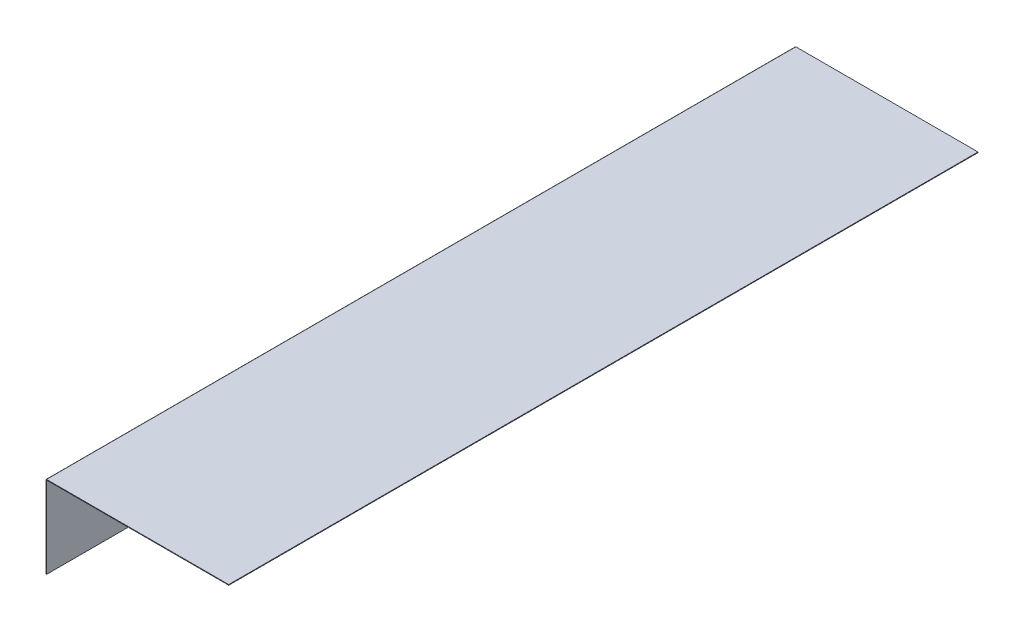
ISO-10303-21;
HEADER;
FILE_DESCRIPTION(('STEP AP214'),'2;1');
FILE_NAME('part.step','',(''),(''),'','','');
FILE_SCHEMA(('AUTOMOTIVE_DESIGN { 1 0 10303 214 1 1 1 1 }'));
ENDSEC;
DATA;
#1=APPLICATION_CONTEXT('core data for automotive mechanical design processes');
#2=APPLICATION_PROTOCOL_DEFINITION('international standard','automotive_design',2000,#1);
#3=PRODUCT_CONTEXT('',#1,'mechanical');
#4=PRODUCT('Part','Part','',(#3));
#5=PRODUCT_RELATED_PRODUCT_CATEGORY('part','',(#4));
#6=PRODUCT_DEFINITION_FORMATION('','',#4);
#7=PRODUCT_DEFINITION_CONTEXT('part definition',#1,'design');
#8=PRODUCT_DEFINITION('design','',#6,#7);
#9=PRODUCT_DEFINITION_SHAPE('','',#8);
#10=(LENGTH_UNIT() NAMED_UNIT(*) SI_UNIT(.MILLI.,.METRE.));
#11=(NAMED_UNIT(*) PLANE_ANGLE_UNIT() SI_UNIT($,.RADIAN.));
#12=(NAMED_UNIT(*) SI_UNIT($,.STERADIAN.) SOLID_ANGLE_UNIT());
#13=UNCERTAINTY_MEASURE_WITH_UNIT(LENGTH_MEASURE(1.E-05),#10,'distance_accuracy_value','');
#14=(GEOMETRIC_REPRESENTATION_CONTEXT(3) GLOBAL_UNCERTAINTY_ASSIGNED_CONTEXT((#13)) GLOBAL_UNIT_ASSIGNED_CONTEXT((#10,
#11,#12)) REPRESENTATION_CONTEXT('',''));
#15=CARTESIAN_POINT('',(0.,0.,0.));
#16=DIRECTION('',(0.,0.,1.));
#17=DIRECTION('',(1.,0.,0.));
#18=AXIS2_PLACEMENT_3D('',#15,#16,#17);
#19=CARTESIAN_POINT('',(1.,0.,1230.));
#20=DIRECTION('',(0.,1.,0.));
#21=DIRECTION('',(-1.,0.,0.));
#22=AXIS2_PLACEMENT_3D('',#19,#20,#21);
#23=PLANE('',#22);
#24=DIRECTION('',(1.,0.,0.));
#25=VECTOR('',#24,1.);
#26=CARTESIAN_POINT('',(1.,0.,0.));
#27=LINE('',#26,#25);
#28=CARTESIAN_POINT('',(0.,0.,0.));
#29=VERTEX_POINT('',#28);
#30=CARTESIAN_POINT('',(1.,0.,0.));
#31=VERTEX_POINT('',#30);
#32=EDGE_CURVE('E124',#29,#31,#27,.T.);
#33=ORIENTED_EDGE('',*,*,#32,.T.);
#34=DIRECTION('',(0.,0.,-1.));
#35=VECTOR('',#34,1.);
#36=CARTESIAN_POINT('',(1.,0.,1230.));
#37=LINE('',#36,#35);
#38=CARTESIAN_POINT('',(1.,0.,1230.));
#39=VERTEX_POINT('',#38);
#40=EDGE_CURVE('E106',#39,#31,#37,.T.);
#41=ORIENTED_EDGE('',*,*,#40,.F.);
#42=DIRECTION('',(1.,0.,0.));
#43=VECTOR('',#42,1.);
#44=CARTESIAN_POINT('',(1.,0.,1230.));
#45=LINE('',#44,#43);
#46=CARTESIAN_POINT('',(0.,0.,1230.));
#47=VERTEX_POINT('',#46);
#48=EDGE_CURVE('E110',#47,#39,#45,.T.);
#49=ORIENTED_EDGE('',*,*,#48,.F.);
#50=DIRECTION('',(0.,0.,-1.));
#51=VECTOR('',#50,1.);
#52=CARTESIAN_POINT('',(0.,0.,1230.));
#53=LINE('',#52,#51);
#54=EDGE_CURVE('E179',#47,#29,#53,.T.);
#55=ORIENTED_EDGE('',*,*,#54,.T.);
#56=EDGE_LOOP('',(#33,#41,#49,#55));
#57=FACE_BOUND('',#56,.T.);
#58=ADVANCED_FACE('F39',(#57),#23,.F.);
#59=CARTESIAN_POINT('',(1.,134.,1230.));
#60=DIRECTION('',(-1.,0.,0.));
#61=DIRECTION('',(0.,-1.,0.));
#62=AXIS2_PLACEMENT_3D('',#59,#60,#61);
#63=PLANE('',#62);
#64=DIRECTION('',(0.,1.,0.));
#65=VECTOR('',#64,1.);
#66=CARTESIAN_POINT('',(1.,134.,0.));
#67=LINE('',#66,#65);
#68=CARTESIAN_POINT('',(1.,133.,0.));
#69=VERTEX_POINT('',#68);
#70=EDGE_CURVE('E157',#31,#69,#67,.T.);
#71=ORIENTED_EDGE('',*,*,#70,.T.);
#72=DIRECTION('',(0.,0.,-1.));
#73=VECTOR('',#72,1.);
#74=CARTESIAN_POINT('',(1.,133.,1230.));
#75=LINE('',#74,#73);
#76=CARTESIAN_POINT('',(1.,133.,1230.));
#77=VERTEX_POINT('',#76);
#78=EDGE_CURVE('E61',#69,#77,#75,.F.);
#79=ORIENTED_EDGE('',*,*,#78,.T.);
#80=DIRECTION('',(0.,1.,0.));
#81=VECTOR('',#80,1.);
#82=CARTESIAN_POINT('',(1.,134.,1230.));
#83=LINE('',#82,#81);
#84=EDGE_CURVE('E102',#39,#77,#83,.T.);
#85=ORIENTED_EDGE('',*,*,#84,.F.);
#86=ORIENTED_EDGE('',*,*,#40,.T.);
#87=EDGE_LOOP('',(#71,#79,#85,#86));
#88=FACE_BOUND('',#87,.T.);
#89=ADVANCED_FACE('F104',(#88),#63,.F.);
#90=CARTESIAN_POINT('',(300.,134.,1230.));
#91=DIRECTION('',(0.,1.,0.));
#92=DIRECTION('',(-1.,0.,0.));
#93=AXIS2_PLACEMENT_3D('',#90,#91,#92);
#94=PLANE('',#93);
#95=DIRECTION('',(1.,0.,0.));
#96=VECTOR('',#95,1.);
#97=CARTESIAN_POINT('',(300.,134.,1230.));
#98=LINE('',#97,#96);
#99=CARTESIAN_POINT('',(2.,134.,1230.));
#100=VERTEX_POINT('',#99);
#101=CARTESIAN_POINT('',(300.,134.,1230.));
#102=VERTEX_POINT('',#101);
#103=EDGE_CURVE('E109',#100,#102,#98,.T.);
#104=ORIENTED_EDGE('',*,*,#103,.F.);
#105=DIRECTION('',(0.,0.,-1.));
#106=VECTOR('',#105,1.);
#107=CARTESIAN_POINT('',(2.,134.,0.));
#108=LINE('',#107,#106);
#109=CARTESIAN_POINT('',(2.,134.,0.));
#110=VERTEX_POINT('',#109);
#111=EDGE_CURVE('E147',#100,#110,#108,.T.);
#112=ORIENTED_EDGE('',*,*,#111,.T.);
#113=DIRECTION('',(1.,0.,0.));
#114=VECTOR('',#113,1.);
#115=CARTESIAN_POINT('',(300.,134.,0.));
#116=LINE('',#115,#114);
#117=CARTESIAN_POINT('',(300.,134.,0.));
#118=VERTEX_POINT('',#117);
#119=EDGE_CURVE('E159',#110,#118,#116,.T.);
#120=ORIENTED_EDGE('',*,*,#119,.T.);
#121=DIRECTION('',(0.,0.,-1.));
#122=VECTOR('',#121,1.);
#123=CARTESIAN_POINT('',(300.,134.,1230.));
#124=LINE('',#123,#122);
#125=EDGE_CURVE('E127',#102,#118,#124,.T.);
#126=ORIENTED_EDGE('',*,*,#125,.F.);
#127=EDGE_LOOP('',(#104,#112,#120,#126));
#128=FACE_BOUND('',#127,.T.);
#129=ADVANCED_FACE('F165',(#128),#94,.F.);
#130=CARTESIAN_POINT('',(300.,135.,1230.));
#131=DIRECTION('',(-1.,0.,0.));
#132=DIRECTION('',(0.,0.,1.));
#133=AXIS2_PLACEMENT_3D('',#130,#131,#132);
#134=PLANE('',#133);
#135=DIRECTION('',(0.,1.,0.));
#136=VECTOR('',#135,1.);
#137=CARTESIAN_POINT('',(300.,135.,0.));
#138=LINE('',#137,#136);
#139=CARTESIAN_POINT('',(300.,135.,0.));
#140=VERTEX_POINT('',#139);
#141=EDGE_CURVE('E184',#118,#140,#138,.T.);
#142=ORIENTED_EDGE('',*,*,#141,.T.);
#143=DIRECTION('',(0.,0.,-1.));
#144=VECTOR('',#143,1.);
#145=CARTESIAN_POINT('',(300.,135.,1230.));
#146=LINE('',#145,#144);
#147=CARTESIAN_POINT('',(300.,135.,1230.));
#148=VERTEX_POINT('',#147);
#149=EDGE_CURVE('E135',#148,#140,#146,.T.);
#150=ORIENTED_EDGE('',*,*,#149,.F.);
#151=DIRECTION('',(0.,1.,0.));
#152=VECTOR('',#151,1.);
#153=CARTESIAN_POINT('',(300.,135.,1230.));
#154=LINE('',#153,#152);
#155=EDGE_CURVE('E169',#102,#148,#154,.T.);
#156=ORIENTED_EDGE('',*,*,#155,.F.);
#157=ORIENTED_EDGE('',*,*,#125,.T.);
#158=EDGE_LOOP('',(#142,#150,#156,#157));
#159=FACE_BOUND('',#158,.T.);
#160=ADVANCED_FACE('F216',(#159),#134,.F.);
#161=CARTESIAN_POINT('',(0.,135.,1230.));
#162=DIRECTION('',(0.,-1.,0.));
#163=DIRECTION('',(0.,0.,-1.));
#164=AXIS2_PLACEMENT_3D('',#161,#162,#163);
#165=PLANE('',#164);
#166=DIRECTION('',(-1.,0.,0.));
#167=VECTOR('',#166,1.);
#168=CARTESIAN_POINT('',(0.,135.,0.));
#169=LINE('',#168,#167);
#170=CARTESIAN_POINT('',(1.,135.,0.));
#171=VERTEX_POINT('',#170);
#172=EDGE_CURVE('E187',#140,#171,#169,.T.);
#173=ORIENTED_EDGE('',*,*,#172,.T.);
#174=DIRECTION('',(0.,0.,-1.));
#175=VECTOR('',#174,1.);
#176=CARTESIAN_POINT('',(1.,135.,1230.));
#177=LINE('',#176,#175);
#178=CARTESIAN_POINT('',(1.,135.,1230.));
#179=VERTEX_POINT('',#178);
#180=EDGE_CURVE('E141',#171,#179,#177,.F.);
#181=ORIENTED_EDGE('',*,*,#180,.T.);
#182=DIRECTION('',(-1.,0.,0.));
#183=VECTOR('',#182,1.);
#184=CARTESIAN_POINT('',(0.,135.,1230.));
#185=LINE('',#184,#183);
#186=EDGE_CURVE('E172',#148,#179,#185,.T.);
#187=ORIENTED_EDGE('',*,*,#186,.F.);
#188=ORIENTED_EDGE('',*,*,#149,.T.);
#189=EDGE_LOOP('',(#173,#181,#187,#188));
#190=FACE_BOUND('',#189,.T.);
#191=ADVANCED_FACE('F200',(#190),#165,.F.);
#192=CARTESIAN_POINT('',(0.,0.,1230.));
#193=DIRECTION('',(1.,0.,0.));
#194=DIRECTION('',(0.,0.,-1.));
#195=AXIS2_PLACEMENT_3D('',#192,#193,#194);
#196=PLANE('',#195);
#197=DIRECTION('',(0.,-1.,0.));
#198=VECTOR('',#197,1.);
#199=CARTESIAN_POINT('',(0.,0.,1230.));
#200=LINE('',#199,#198);
#201=CARTESIAN_POINT('',(0.,134.,1230.));
#202=VERTEX_POINT('',#201);
#203=EDGE_CURVE('E116',#202,#47,#200,.T.);
#204=ORIENTED_EDGE('',*,*,#203,.F.);
#205=DIRECTION('',(0.,0.,-1.));
#206=VECTOR('',#205,1.);
#207=CARTESIAN_POINT('',(0.,134.,1230.));
#208=LINE('',#207,#206);
#209=CARTESIAN_POINT('',(0.,134.,0.));
#210=VERTEX_POINT('',#209);
#211=EDGE_CURVE('E126',#202,#210,#208,.T.);
#212=ORIENTED_EDGE('',*,*,#211,.T.);
#213=DIRECTION('',(0.,-1.,0.));
#214=VECTOR('',#213,1.);
#215=CARTESIAN_POINT('',(0.,0.,0.));
#216=LINE('',#215,#214);
#217=EDGE_CURVE('E121',#210,#29,#216,.T.);
#218=ORIENTED_EDGE('',*,*,#217,.T.);
#219=ORIENTED_EDGE('',*,*,#54,.F.);
#220=EDGE_LOOP('',(#204,#212,#218,#219));
#221=FACE_BOUND('',#220,.T.);
#222=ADVANCED_FACE('F208',(#221),#196,.F.);
#223=CARTESIAN_POINT('',(0.,0.,1230.));
#224=DIRECTION('',(0.,0.,-1.));
#225=DIRECTION('',(-1.,0.,0.));
#226=AXIS2_PLACEMENT_3D('',#223,#224,#225);
#227=PLANE('',#226);
#228=ORIENTED_EDGE('',*,*,#186,.T.);
#229=CARTESIAN_POINT('',(1.,134.,1230.));
#230=DIRECTION('',(0.,0.,-1.));
#231=DIRECTION('',(-1.,0.,0.));
#232=AXIS2_PLACEMENT_3D('',#229,#230,#231);
#233=CIRCLE('',#232,1.);
#234=EDGE_CURVE('E144',#179,#202,#233,.F.);
#235=ORIENTED_EDGE('',*,*,#234,.T.);
#236=ORIENTED_EDGE('',*,*,#203,.T.);
#237=ORIENTED_EDGE('',*,*,#48,.T.);
#238=ORIENTED_EDGE('',*,*,#84,.T.);
#239=CARTESIAN_POINT('',(2.,133.,1230.));
#240=DIRECTION('',(0.,0.,-1.));
#241=DIRECTION('',(-1.,0.,0.));
#242=AXIS2_PLACEMENT_3D('',#239,#240,#241);
#243=CIRCLE('',#242,1.);
#244=EDGE_CURVE('E11',#77,#100,#243,.T.);
#245=ORIENTED_EDGE('',*,*,#244,.T.);
#246=ORIENTED_EDGE('',*,*,#103,.T.);
#247=ORIENTED_EDGE('',*,*,#155,.T.);
#248=EDGE_LOOP('',(#228,#235,#236,#237,#238,#245,#246,#247));
#249=FACE_BOUND('',#248,.T.);
#250=ADVANCED_FACE('F114',(#249),#227,.F.);
#251=CARTESIAN_POINT('',(0.,0.,0.));
#252=DIRECTION('',(0.,0.,-1.));
#253=DIRECTION('',(-1.,0.,0.));
#254=AXIS2_PLACEMENT_3D('',#251,#252,#253);
#255=PLANE('',#254);
#256=ORIENTED_EDGE('',*,*,#217,.F.);
#257=CARTESIAN_POINT('',(1.,134.,0.));
#258=DIRECTION('',(0.,0.,-1.));
#259=DIRECTION('',(-1.,0.,0.));
#260=AXIS2_PLACEMENT_3D('',#257,#258,#259);
#261=CIRCLE('',#260,1.);
#262=EDGE_CURVE('E132',#210,#171,#261,.T.);
#263=ORIENTED_EDGE('',*,*,#262,.T.);
#264=ORIENTED_EDGE('',*,*,#172,.F.);
#265=ORIENTED_EDGE('',*,*,#141,.F.);
#266=ORIENTED_EDGE('',*,*,#119,.F.);
#267=CARTESIAN_POINT('',(2.,133.,0.));
#268=DIRECTION('',(0.,0.,-1.));
#269=DIRECTION('',(-1.,0.,0.));
#270=AXIS2_PLACEMENT_3D('',#267,#268,#269);
#271=CIRCLE('',#270,1.);
#272=EDGE_CURVE('E48',#110,#69,#271,.F.);
#273=ORIENTED_EDGE('',*,*,#272,.T.);
#274=ORIENTED_EDGE('',*,*,#70,.F.);
#275=ORIENTED_EDGE('',*,*,#32,.F.);
#276=EDGE_LOOP('',(#256,#263,#264,#265,#266,#273,#274,#275));
#277=FACE_BOUND('',#276,.T.);
#278=ADVANCED_FACE('F156',(#277),#255,.T.);
#279=CARTESIAN_POINT('',(1.,134.,1230.));
#280=DIRECTION('',(0.,0.,-1.));
#281=DIRECTION('',(-1.,0.,0.));
#282=AXIS2_PLACEMENT_3D('',#279,#280,#281);
#283=CYLINDRICAL_SURFACE('',#282,1.);
#284=ORIENTED_EDGE('',*,*,#234,.F.);
#285=ORIENTED_EDGE('',*,*,#180,.F.);
#286=ORIENTED_EDGE('',*,*,#262,.F.);
#287=ORIENTED_EDGE('',*,*,#211,.F.);
#288=EDGE_LOOP('',(#284,#285,#286,#287));
#289=FACE_BOUND('',#288,.T.);
#290=ADVANCED_FACE('F206',(#289),#283,.T.);
#291=CARTESIAN_POINT('',(2.,133.,1230.));
#292=DIRECTION('',(0.,0.,1.));
#293=DIRECTION('',(1.,0.,0.));
#294=AXIS2_PLACEMENT_3D('',#291,#292,#293);
#295=CYLINDRICAL_SURFACE('',#294,1.);
#296=ORIENTED_EDGE('',*,*,#244,.F.);
#297=ORIENTED_EDGE('',*,*,#78,.F.);
#298=ORIENTED_EDGE('',*,*,#272,.F.);
#299=ORIENTED_EDGE('',*,*,#111,.F.);
#300=EDGE_LOOP('',(#296,#297,#298,#299));
#301=FACE_BOUND('',#300,.T.);
#302=ADVANCED_FACE('F41',(#301),#295,.F.);
#303=CLOSED_SHELL('',(#58,#89,#129,#160,#191,#222,#250,#278,#290,#302));
#304=MANIFOLD_SOLID_BREP('B2',#303);
#305=ADVANCED_BREP_SHAPE_REPRESENTATION('',(#18,#304),#14);
#306=SHAPE_DEFINITION_REPRESENTATION(#9,#305);
ENDSEC;
END-ISO-10303-21;
